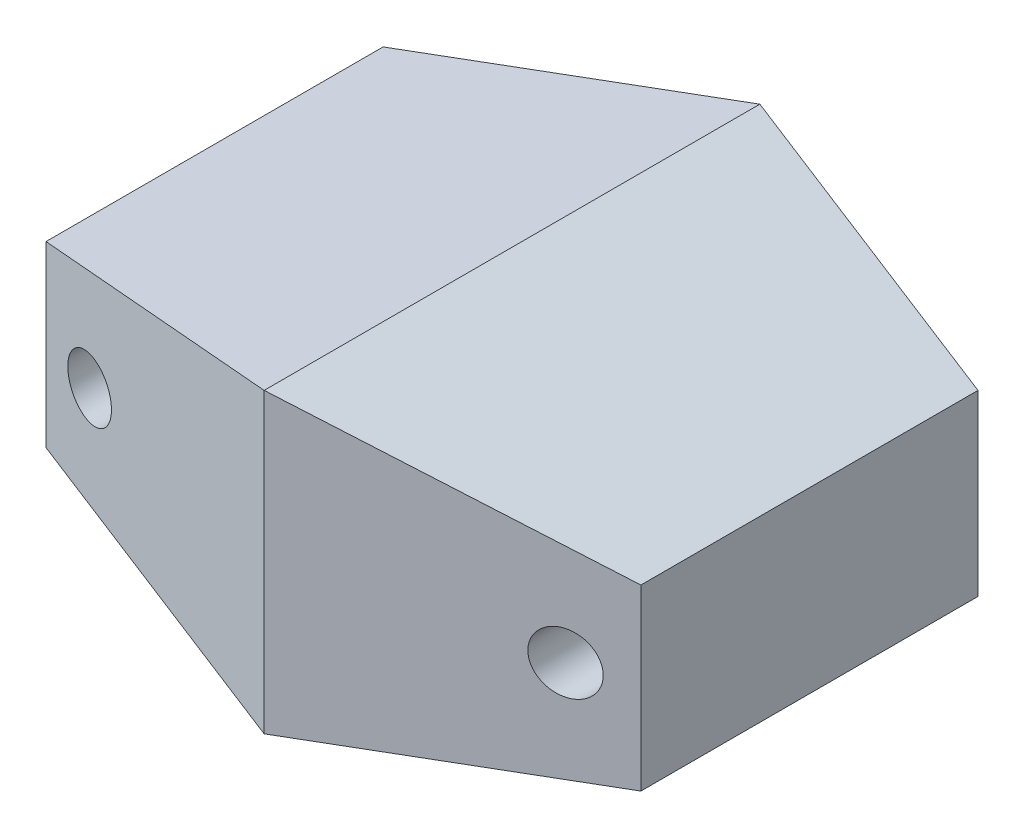
ISO-10303-21;
HEADER;
FILE_DESCRIPTION(('STEP AP214'),'2;1');
FILE_NAME('part.step','',(''),(''),'','','');
FILE_SCHEMA(('AUTOMOTIVE_DESIGN { 1 0 10303 214 1 1 1 1 }'));
ENDSEC;
DATA;
#1=APPLICATION_CONTEXT('core data for automotive mechanical design processes');
#2=APPLICATION_PROTOCOL_DEFINITION('international standard','automotive_design',2000,#1);
#3=PRODUCT_CONTEXT('',#1,'mechanical');
#4=PRODUCT('Part','Part','',(#3));
#5=PRODUCT_RELATED_PRODUCT_CATEGORY('part','',(#4));
#6=PRODUCT_DEFINITION_FORMATION('','',#4);
#7=PRODUCT_DEFINITION_CONTEXT('part definition',#1,'design');
#8=PRODUCT_DEFINITION('design','',#6,#7);
#9=PRODUCT_DEFINITION_SHAPE('','',#8);
#10=(LENGTH_UNIT() NAMED_UNIT(*) SI_UNIT(.MILLI.,.METRE.));
#11=(NAMED_UNIT(*) PLANE_ANGLE_UNIT() SI_UNIT($,.RADIAN.));
#12=(NAMED_UNIT(*) SI_UNIT($,.STERADIAN.) SOLID_ANGLE_UNIT());
#13=UNCERTAINTY_MEASURE_WITH_UNIT(LENGTH_MEASURE(1.E-05),#10,'distance_accuracy_value','');
#14=(GEOMETRIC_REPRESENTATION_CONTEXT(3) GLOBAL_UNCERTAINTY_ASSIGNED_CONTEXT((#13)) GLOBAL_UNIT_ASSIGNED_CONTEXT((#10,
#11,#12)) REPRESENTATION_CONTEXT('',''));
#15=CARTESIAN_POINT('',(0.,0.,0.));
#16=DIRECTION('',(0.,0.,1.));
#17=DIRECTION('',(1.,0.,0.));
#18=AXIS2_PLACEMENT_3D('',#15,#16,#17);
#19=CARTESIAN_POINT('',(30.,-15.,50.));
#20=DIRECTION('',(-1.,0.,0.));
#21=DIRECTION('',(0.,0.,1.));
#22=AXIS2_PLACEMENT_3D('',#19,#20,#21);
#23=PLANE('',#22);
#24=DIRECTION('',(0.,0.,1.));
#25=VECTOR('',#24,1.);
#26=CARTESIAN_POINT('',(30.,-8.99999999999999,0.));
#27=LINE('',#26,#25);
#28=CARTESIAN_POINT('',(30.,-8.99999999999998,8.00000000000004));
#29=VERTEX_POINT('',#28);
#30=CARTESIAN_POINT('',(30.0000000000001,-8.99999999999999,42.));
#31=VERTEX_POINT('',#30);
#32=EDGE_CURVE('E200',#29,#31,#27,.T.);
#33=ORIENTED_EDGE('',*,*,#32,.F.);
#34=DIRECTION('',(0.,1.,0.));
#35=VECTOR('',#34,1.);
#36=CARTESIAN_POINT('',(30.,-15.,8.00000000000005));
#37=LINE('',#36,#35);
#38=CARTESIAN_POINT('',(30.,8.99999999999998,8.00000000000004));
#39=VERTEX_POINT('',#38);
#40=EDGE_CURVE('E184',#29,#39,#37,.T.);
#41=ORIENTED_EDGE('',*,*,#40,.T.);
#42=DIRECTION('',(0.,0.,1.));
#43=VECTOR('',#42,1.);
#44=CARTESIAN_POINT('',(30.,8.99999999999999,0.));
#45=LINE('',#44,#43);
#46=CARTESIAN_POINT('',(30.0000000000001,8.99999999999998,42.));
#47=VERTEX_POINT('',#46);
#48=EDGE_CURVE('E182',#39,#47,#45,.T.);
#49=ORIENTED_EDGE('',*,*,#48,.T.);
#50=DIRECTION('',(0.,1.,0.));
#51=VECTOR('',#50,1.);
#52=CARTESIAN_POINT('',(30.0000000000001,-15.,42.));
#53=LINE('',#52,#51);
#54=EDGE_CURVE('E228',#31,#47,#53,.T.);
#55=ORIENTED_EDGE('',*,*,#54,.F.);
#56=EDGE_LOOP('',(#33,#41,#49,#55));
#57=FACE_BOUND('',#56,.T.);
#58=ADVANCED_FACE('F110',(#57),#23,.F.);
#59=CARTESIAN_POINT('',(2.88461538461539,-14.4230769230769,0.));
#60=DIRECTION('',(0.196116135138184,-0.98058067569092,0.));
#61=DIRECTION('',(0.98058067569092,0.196116135138184,0.));
#62=AXIS2_PLACEMENT_3D('',#59,#60,#61);
#63=PLANE('',#62);
#64=DIRECTION('',(-0.948683298050513,-0.189736659610103,-0.252982212813471));
#65=VECTOR('',#64,1.);
#66=CARTESIAN_POINT('',(2.7,-14.46,0.720000000000004));
#67=LINE('',#66,#65);
#68=CARTESIAN_POINT('',(0.,-15.,0.));
#69=VERTEX_POINT('',#68);
#70=EDGE_CURVE('E135',#29,#69,#67,.T.);
#71=ORIENTED_EDGE('',*,*,#70,.F.);
#72=ORIENTED_EDGE('',*,*,#32,.T.);
#73=DIRECTION('',(-0.948683298050513,-0.189736659610103,0.252982212813471));
#74=VECTOR('',#73,1.);
#75=CARTESIAN_POINT('',(14.7,-12.06,46.08));
#76=LINE('',#75,#74);
#77=CARTESIAN_POINT('',(0.,-15.,50.));
#78=VERTEX_POINT('',#77);
#79=EDGE_CURVE('E242',#31,#78,#76,.T.);
#80=ORIENTED_EDGE('',*,*,#79,.T.);
#81=DIRECTION('',(0.,0.,1.));
#82=VECTOR('',#81,1.);
#83=CARTESIAN_POINT('',(0.,-15.,0.));
#84=LINE('',#83,#82);
#85=EDGE_CURVE('E194',#69,#78,#84,.T.);
#86=ORIENTED_EDGE('',*,*,#85,.F.);
#87=EDGE_LOOP('',(#71,#72,#80,#86));
#88=FACE_BOUND('',#87,.T.);
#89=ADVANCED_FACE('F264',(#88),#63,.T.);
#90=CARTESIAN_POINT('',(2.88461538461539,14.4230769230769,0.));
#91=DIRECTION('',(-0.196116135138184,-0.98058067569092,0.));
#92=DIRECTION('',(0.98058067569092,-0.196116135138184,0.));
#93=AXIS2_PLACEMENT_3D('',#90,#91,#92);
#94=PLANE('',#93);
#95=ORIENTED_EDGE('',*,*,#48,.F.);
#96=DIRECTION('',(-0.948683298050513,0.189736659610103,-0.252982212813471));
#97=VECTOR('',#96,1.);
#98=CARTESIAN_POINT('',(2.7,14.46,0.720000000000004));
#99=LINE('',#98,#97);
#100=CARTESIAN_POINT('',(0.,15.,0.));
#101=VERTEX_POINT('',#100);
#102=EDGE_CURVE('E165',#39,#101,#99,.T.);
#103=ORIENTED_EDGE('',*,*,#102,.T.);
#104=DIRECTION('',(0.,0.,1.));
#105=VECTOR('',#104,1.);
#106=CARTESIAN_POINT('',(0.,15.,0.));
#107=LINE('',#106,#105);
#108=CARTESIAN_POINT('',(0.,15.,50.));
#109=VERTEX_POINT('',#108);
#110=EDGE_CURVE('E180',#101,#109,#107,.T.);
#111=ORIENTED_EDGE('',*,*,#110,.T.);
#112=DIRECTION('',(-0.948683298050513,0.189736659610103,0.252982212813471));
#113=VECTOR('',#112,1.);
#114=CARTESIAN_POINT('',(14.7,12.06,46.08));
#115=LINE('',#114,#113);
#116=EDGE_CURVE('E239',#47,#109,#115,.T.);
#117=ORIENTED_EDGE('',*,*,#116,.F.);
#118=EDGE_LOOP('',(#95,#103,#111,#117));
#119=FACE_BOUND('',#118,.T.);
#120=ADVANCED_FACE('F177',(#119),#94,.F.);
#121=CARTESIAN_POINT('',(-30.,-15.,50.));
#122=DIRECTION('',(1.,0.,0.));
#123=DIRECTION('',(0.,0.,-1.));
#124=AXIS2_PLACEMENT_3D('',#121,#122,#123);
#125=PLANE('',#124);
#126=DIRECTION('',(0.,1.,0.));
#127=VECTOR('',#126,1.);
#128=CARTESIAN_POINT('',(-30.,-15.,8.));
#129=LINE('',#128,#127);
#130=CARTESIAN_POINT('',(-30.,-9.,8.));
#131=VERTEX_POINT('',#130);
#132=CARTESIAN_POINT('',(-30.,8.99999999999999,8.));
#133=VERTEX_POINT('',#132);
#134=EDGE_CURVE('E172',#131,#133,#129,.T.);
#135=ORIENTED_EDGE('',*,*,#134,.F.);
#136=DIRECTION('',(0.,0.,1.));
#137=VECTOR('',#136,1.);
#138=CARTESIAN_POINT('',(-30.,-8.99999999999999,0.));
#139=LINE('',#138,#137);
#140=CARTESIAN_POINT('',(-30.,-8.99999999999999,42.));
#141=VERTEX_POINT('',#140);
#142=EDGE_CURVE('E254',#131,#141,#139,.T.);
#143=ORIENTED_EDGE('',*,*,#142,.T.);
#144=DIRECTION('',(0.,1.,0.));
#145=VECTOR('',#144,1.);
#146=CARTESIAN_POINT('',(-30.,-15.,42.));
#147=LINE('',#146,#145);
#148=CARTESIAN_POINT('',(-30.,8.99999999999999,42.));
#149=VERTEX_POINT('',#148);
#150=EDGE_CURVE('E127',#141,#149,#147,.T.);
#151=ORIENTED_EDGE('',*,*,#150,.T.);
#152=DIRECTION('',(0.,0.,1.));
#153=VECTOR('',#152,1.);
#154=CARTESIAN_POINT('',(-30.,8.99999999999999,0.));
#155=LINE('',#154,#153);
#156=EDGE_CURVE('E199',#133,#149,#155,.T.);
#157=ORIENTED_EDGE('',*,*,#156,.F.);
#158=EDGE_LOOP('',(#135,#143,#151,#157));
#159=FACE_BOUND('',#158,.T.);
#160=ADVANCED_FACE('F279',(#159),#125,.F.);
#161=CARTESIAN_POINT('',(-2.88461538461538,14.4230769230769,0.));
#162=DIRECTION('',(-0.196116135138184,0.98058067569092,0.));
#163=DIRECTION('',(-0.98058067569092,-0.196116135138184,0.));
#164=AXIS2_PLACEMENT_3D('',#161,#162,#163);
#165=PLANE('',#164);
#166=ORIENTED_EDGE('',*,*,#110,.F.);
#167=DIRECTION('',(-0.948683298050514,-0.189736659610103,0.25298221281347));
#168=VECTOR('',#167,1.);
#169=CARTESIAN_POINT('',(-2.7,14.46,0.72));
#170=LINE('',#169,#168);
#171=EDGE_CURVE('E187',#101,#133,#170,.T.);
#172=ORIENTED_EDGE('',*,*,#171,.T.);
#173=ORIENTED_EDGE('',*,*,#156,.T.);
#174=DIRECTION('',(-0.948683298050514,-0.189736659610103,-0.25298221281347));
#175=VECTOR('',#174,1.);
#176=CARTESIAN_POINT('',(-14.7,12.06,46.08));
#177=LINE('',#176,#175);
#178=EDGE_CURVE('E171',#109,#149,#177,.T.);
#179=ORIENTED_EDGE('',*,*,#178,.F.);
#180=EDGE_LOOP('',(#166,#172,#173,#179));
#181=FACE_BOUND('',#180,.T.);
#182=ADVANCED_FACE('F197',(#181),#165,.T.);
#183=CARTESIAN_POINT('',(-2.88461538461538,-14.4230769230769,0.));
#184=DIRECTION('',(0.196116135138184,0.98058067569092,0.));
#185=DIRECTION('',(-0.98058067569092,0.196116135138184,0.));
#186=AXIS2_PLACEMENT_3D('',#183,#184,#185);
#187=PLANE('',#186);
#188=DIRECTION('',(-0.948683298050514,0.189736659610103,0.25298221281347));
#189=VECTOR('',#188,1.);
#190=CARTESIAN_POINT('',(-2.7,-14.46,0.72));
#191=LINE('',#190,#189);
#192=EDGE_CURVE('E12',#69,#131,#191,.T.);
#193=ORIENTED_EDGE('',*,*,#192,.F.);
#194=ORIENTED_EDGE('',*,*,#85,.T.);
#195=DIRECTION('',(-0.948683298050514,0.189736659610103,-0.25298221281347));
#196=VECTOR('',#195,1.);
#197=CARTESIAN_POINT('',(-14.7,-12.06,46.08));
#198=LINE('',#197,#196);
#199=EDGE_CURVE('E119',#78,#141,#198,.T.);
#200=ORIENTED_EDGE('',*,*,#199,.T.);
#201=ORIENTED_EDGE('',*,*,#142,.F.);
#202=EDGE_LOOP('',(#193,#194,#200,#201));
#203=FACE_BOUND('',#202,.T.);
#204=ADVANCED_FACE('F261',(#203),#187,.F.);
#205=CARTESIAN_POINT('',(-12.448132780083,-15.,46.6804979253112));
#206=DIRECTION('',(0.257662650560332,0.,-0.966234939601246));
#207=DIRECTION('',(-0.966234939601246,0.,-0.257662650560332));
#208=AXIS2_PLACEMENT_3D('',#205,#206,#207);
#209=PLANE('',#208);
#210=CARTESIAN_POINT('',(-24.,0.,43.6));
#211=DIRECTION('',(0.257662650560332,0.,-0.966234939601246));
#212=DIRECTION('',(0.966234939601246,0.,0.257662650560332));
#213=AXIS2_PLACEMENT_3D('',#210,#211,#212);
#214=ELLIPSE('',#213,3.10483493925201,3.);
#215=CARTESIAN_POINT('',(-21.,0.,44.4));
#216=VERTEX_POINT('',#215);
#217=EDGE_CURVE('E223',#216,#216,#214,.T.);
#218=ORIENTED_EDGE('',*,*,#217,.T.);
#219=EDGE_LOOP('',(#218));
#220=FACE_BOUND('',#219,.T.);
#221=ORIENTED_EDGE('',*,*,#178,.T.);
#222=ORIENTED_EDGE('',*,*,#150,.F.);
#223=ORIENTED_EDGE('',*,*,#199,.F.);
#224=DIRECTION('',(0.,1.,0.));
#225=VECTOR('',#224,1.);
#226=CARTESIAN_POINT('',(0.,-15.,50.));
#227=LINE('',#226,#225);
#228=EDGE_CURVE('E231',#78,#109,#227,.T.);
#229=ORIENTED_EDGE('',*,*,#228,.T.);
#230=EDGE_LOOP('',(#221,#222,#223,#229));
#231=FACE_BOUND('',#230,.T.);
#232=ADVANCED_FACE('F268',(#220,#231),#209,.F.);
#233=CARTESIAN_POINT('',(0.,-15.,0.));
#234=DIRECTION('',(-0.257662650560332,0.,-0.966234939601246));
#235=DIRECTION('',(-0.966234939601246,0.,0.257662650560332));
#236=AXIS2_PLACEMENT_3D('',#233,#234,#235);
#237=PLANE('',#236);
#238=CARTESIAN_POINT('',(-24.,0.,6.4));
#239=DIRECTION('',(-0.257662650560332,0.,-0.966234939601246));
#240=DIRECTION('',(-0.966234939601246,0.,0.257662650560332));
#241=AXIS2_PLACEMENT_3D('',#238,#239,#240);
#242=ELLIPSE('',#241,3.10483493925201,3.);
#243=CARTESIAN_POINT('',(-27.,0.,7.2));
#244=VERTEX_POINT('',#243);
#245=EDGE_CURVE('E113',#244,#244,#242,.T.);
#246=ORIENTED_EDGE('',*,*,#245,.F.);
#247=EDGE_LOOP('',(#246));
#248=FACE_BOUND('',#247,.T.);
#249=DIRECTION('',(0.,1.,0.));
#250=VECTOR('',#249,1.);
#251=CARTESIAN_POINT('',(0.,-15.,0.));
#252=LINE('',#251,#250);
#253=EDGE_CURVE('E162',#69,#101,#252,.T.);
#254=ORIENTED_EDGE('',*,*,#253,.F.);
#255=ORIENTED_EDGE('',*,*,#192,.T.);
#256=ORIENTED_EDGE('',*,*,#134,.T.);
#257=ORIENTED_EDGE('',*,*,#171,.F.);
#258=EDGE_LOOP('',(#254,#255,#256,#257));
#259=FACE_BOUND('',#258,.T.);
#260=ADVANCED_FACE('F188',(#248,#259),#237,.T.);
#261=CARTESIAN_POINT('',(0.,-15.,0.));
#262=DIRECTION('',(-0.257662650560333,0.,0.966234939601246));
#263=DIRECTION('',(0.966234939601246,0.,0.257662650560333));
#264=AXIS2_PLACEMENT_3D('',#261,#262,#263);
#265=PLANE('',#264);
#266=CARTESIAN_POINT('',(24.,0.,6.40000000000004));
#267=DIRECTION('',(-0.257662650560333,0.,0.966234939601246));
#268=DIRECTION('',(0.966234939601246,0.,0.257662650560333));
#269=AXIS2_PLACEMENT_3D('',#266,#267,#268);
#270=ELLIPSE('',#269,3.10483493925201,3.);
#271=CARTESIAN_POINT('',(27.,0.,7.20000000000004));
#272=VERTEX_POINT('',#271);
#273=EDGE_CURVE('E213',#272,#272,#270,.T.);
#274=ORIENTED_EDGE('',*,*,#273,.T.);
#275=EDGE_LOOP('',(#274));
#276=FACE_BOUND('',#275,.T.);
#277=ORIENTED_EDGE('',*,*,#70,.T.);
#278=ORIENTED_EDGE('',*,*,#253,.T.);
#279=ORIENTED_EDGE('',*,*,#102,.F.);
#280=ORIENTED_EDGE('',*,*,#40,.F.);
#281=EDGE_LOOP('',(#277,#278,#279,#280));
#282=FACE_BOUND('',#281,.T.);
#283=ADVANCED_FACE('F164',(#276,#282),#265,.F.);
#284=CARTESIAN_POINT('',(12.448132780083,-15.,46.6804979253112));
#285=DIRECTION('',(0.257662650560333,0.,0.966234939601246));
#286=DIRECTION('',(0.966234939601246,0.,-0.257662650560333));
#287=AXIS2_PLACEMENT_3D('',#284,#285,#286);
#288=PLANE('',#287);
#289=CARTESIAN_POINT('',(24.,0.,43.6));
#290=DIRECTION('',(0.257662650560333,0.,0.966234939601246));
#291=DIRECTION('',(-0.966234939601246,0.,0.257662650560333));
#292=AXIS2_PLACEMENT_3D('',#289,#290,#291);
#293=ELLIPSE('',#292,3.10483493925201,3.);
#294=CARTESIAN_POINT('',(21.,0.,44.4));
#295=VERTEX_POINT('',#294);
#296=EDGE_CURVE('E210',#295,#295,#293,.T.);
#297=ORIENTED_EDGE('',*,*,#296,.F.);
#298=EDGE_LOOP('',(#297));
#299=FACE_BOUND('',#298,.T.);
#300=ORIENTED_EDGE('',*,*,#54,.T.);
#301=ORIENTED_EDGE('',*,*,#116,.T.);
#302=ORIENTED_EDGE('',*,*,#228,.F.);
#303=ORIENTED_EDGE('',*,*,#79,.F.);
#304=EDGE_LOOP('',(#300,#301,#302,#303));
#305=FACE_BOUND('',#304,.T.);
#306=ADVANCED_FACE('F269',(#299,#305),#288,.T.);
#307=CARTESIAN_POINT('',(24.,0.,-1.2E-05));
#308=DIRECTION('',(0.,0.,1.));
#309=DIRECTION('',(1.,0.,0.));
#310=AXIS2_PLACEMENT_3D('',#307,#308,#309);
#311=CYLINDRICAL_SURFACE('',#310,3.);
#312=ORIENTED_EDGE('',*,*,#296,.T.);
#313=EDGE_LOOP('',(#312));
#314=FACE_BOUND('',#313,.T.);
#315=ORIENTED_EDGE('',*,*,#273,.F.);
#316=EDGE_LOOP('',(#315));
#317=FACE_BOUND('',#316,.T.);
#318=ADVANCED_FACE('F303',(#314,#317),#311,.F.);
#319=CARTESIAN_POINT('',(-24.,0.,-1.2E-05));
#320=DIRECTION('',(0.,0.,1.));
#321=DIRECTION('',(1.,0.,0.));
#322=AXIS2_PLACEMENT_3D('',#319,#320,#321);
#323=CYLINDRICAL_SURFACE('',#322,3.);
#324=ORIENTED_EDGE('',*,*,#245,.T.);
#325=EDGE_LOOP('',(#324));
#326=FACE_BOUND('',#325,.T.);
#327=ORIENTED_EDGE('',*,*,#217,.F.);
#328=EDGE_LOOP('',(#327));
#329=FACE_BOUND('',#328,.T.);
#330=ADVANCED_FACE('F309',(#326,#329),#323,.F.);
#331=CLOSED_SHELL('',(#58,#89,#120,#160,#182,#204,#232,#260,#283,#306,#318,#330));
#332=MANIFOLD_SOLID_BREP('B2',#331);
#333=ADVANCED_BREP_SHAPE_REPRESENTATION('',(#18,#332),#14);
#334=SHAPE_DEFINITION_REPRESENTATION(#9,#333);
ENDSEC;
END-ISO-10303-21;
